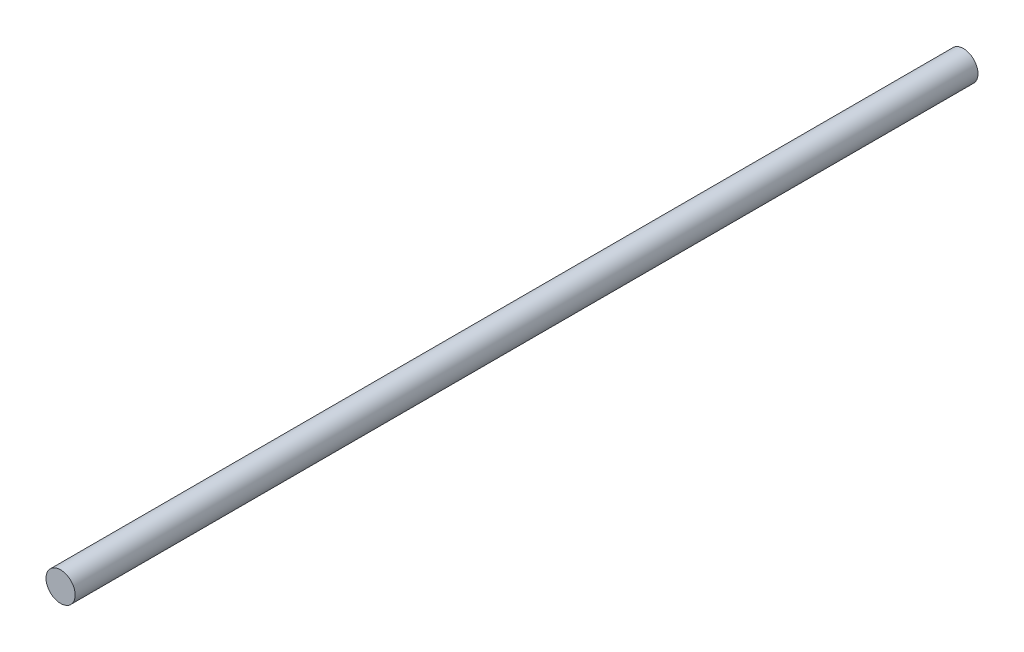
ISO-10303-21;
HEADER;
FILE_DESCRIPTION(('STEP AP214'),'2;1');
FILE_NAME('part.step','',(''),(''),'','','');
FILE_SCHEMA(('AUTOMOTIVE_DESIGN { 1 0 10303 214 1 1 1 1 }'));
ENDSEC;
DATA;
#1=APPLICATION_CONTEXT('core data for automotive mechanical design processes');
#2=APPLICATION_PROTOCOL_DEFINITION('international standard','automotive_design',2000,#1);
#3=PRODUCT_CONTEXT('',#1,'mechanical');
#4=PRODUCT('Part','Part','',(#3));
#5=PRODUCT_RELATED_PRODUCT_CATEGORY('part','',(#4));
#6=PRODUCT_DEFINITION_FORMATION('','',#4);
#7=PRODUCT_DEFINITION_CONTEXT('part definition',#1,'design');
#8=PRODUCT_DEFINITION('design','',#6,#7);
#9=PRODUCT_DEFINITION_SHAPE('','',#8);
#10=(LENGTH_UNIT() NAMED_UNIT(*) SI_UNIT(.MILLI.,.METRE.));
#11=(NAMED_UNIT(*) PLANE_ANGLE_UNIT() SI_UNIT($,.RADIAN.));
#12=(NAMED_UNIT(*) SI_UNIT($,.STERADIAN.) SOLID_ANGLE_UNIT());
#13=UNCERTAINTY_MEASURE_WITH_UNIT(LENGTH_MEASURE(1.E-05),#10,'distance_accuracy_value','');
#14=(GEOMETRIC_REPRESENTATION_CONTEXT(3) GLOBAL_UNCERTAINTY_ASSIGNED_CONTEXT((#13)) GLOBAL_UNIT_ASSIGNED_CONTEXT((#10,
#11,#12)) REPRESENTATION_CONTEXT('',''));
#15=CARTESIAN_POINT('',(0.,0.,0.));
#16=DIRECTION('',(0.,0.,1.));
#17=DIRECTION('',(1.,0.,0.));
#18=AXIS2_PLACEMENT_3D('',#15,#16,#17);
#19=CARTESIAN_POINT('',(0.,0.,49.5630913408264));
#20=DIRECTION('',(0.,0.,1.));
#21=DIRECTION('',(1.,0.,0.));
#22=AXIS2_PLACEMENT_3D('',#19,#20,#21);
#23=PLANE('',#22);
#24=CARTESIAN_POINT('',(0.,0.,49.5630913408264));
#25=DIRECTION('',(0.,0.,-1.));
#26=DIRECTION('',(-1.,0.,0.));
#27=AXIS2_PLACEMENT_3D('',#24,#25,#26);
#28=CIRCLE('',#27,1.6);
#29=CARTESIAN_POINT('',(-1.6,0.,49.5630913408264));
#30=VERTEX_POINT('',#29);
#31=EDGE_CURVE('E9',#30,#30,#28,.T.);
#32=ORIENTED_EDGE('',*,*,#31,.F.);
#33=EDGE_LOOP('',(#32));
#34=FACE_BOUND('',#33,.T.);
#35=ADVANCED_FACE('F14',(#34),#23,.T.);
#36=CARTESIAN_POINT('',(0.,0.,-49.5630913408264));
#37=DIRECTION('',(0.,0.,-1.));
#38=DIRECTION('',(-1.,0.,0.));
#39=AXIS2_PLACEMENT_3D('',#36,#37,#38);
#40=PLANE('',#39);
#41=CARTESIAN_POINT('',(0.,0.,-49.5630913408264));
#42=DIRECTION('',(0.,0.,1.));
#43=DIRECTION('',(1.,0.,0.));
#44=AXIS2_PLACEMENT_3D('',#41,#42,#43);
#45=CIRCLE('',#44,1.6);
#46=CARTESIAN_POINT('',(1.6,0.,-49.5630913408264));
#47=VERTEX_POINT('',#46);
#48=EDGE_CURVE('E21',#47,#47,#45,.T.);
#49=ORIENTED_EDGE('',*,*,#48,.F.);
#50=EDGE_LOOP('',(#49));
#51=FACE_BOUND('',#50,.T.);
#52=ADVANCED_FACE('F29',(#51),#40,.T.);
#53=CARTESIAN_POINT('',(0.,0.,-49.5630913408264));
#54=DIRECTION('',(0.,0.,1.));
#55=DIRECTION('',(1.,0.,0.));
#56=AXIS2_PLACEMENT_3D('',#53,#54,#55);
#57=CYLINDRICAL_SURFACE('',#56,1.6);
#58=ORIENTED_EDGE('',*,*,#31,.T.);
#59=EDGE_LOOP('',(#58));
#60=FACE_BOUND('',#59,.T.);
#61=ORIENTED_EDGE('',*,*,#48,.T.);
#62=EDGE_LOOP('',(#61));
#63=FACE_BOUND('',#62,.T.);
#64=ADVANCED_FACE('F16',(#60,#63),#57,.T.);
#65=CLOSED_SHELL('',(#35,#52,#64));
#66=MANIFOLD_SOLID_BREP('B1',#65);
#67=ADVANCED_BREP_SHAPE_REPRESENTATION('',(#18,#66),#14);
#68=SHAPE_DEFINITION_REPRESENTATION(#9,#67);
ENDSEC;
END-ISO-10303-21;
